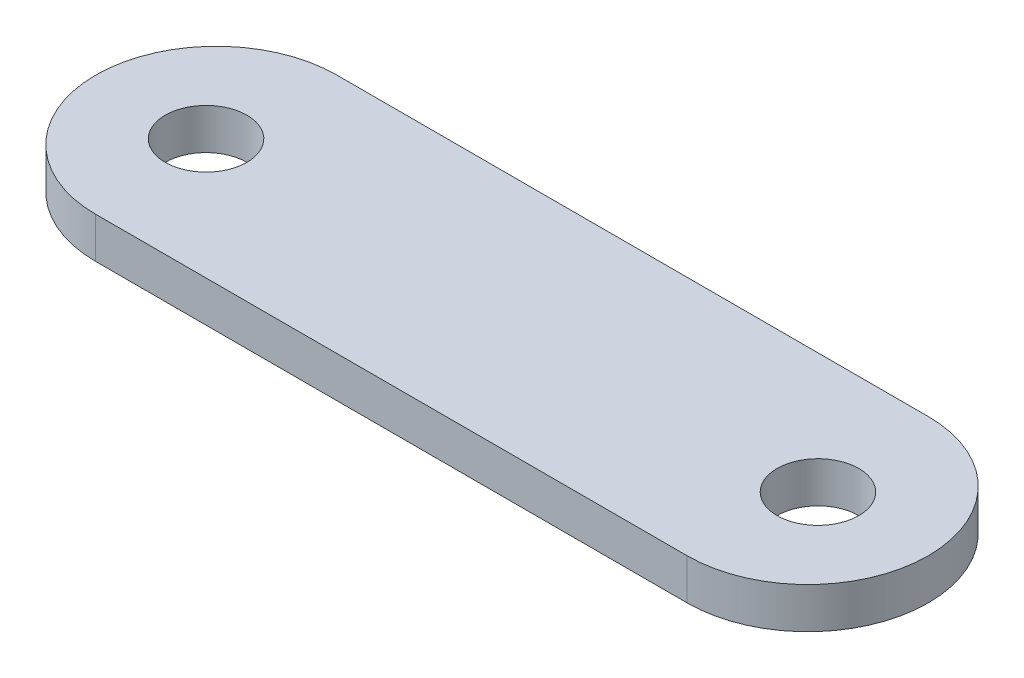
ISO-10303-21;
HEADER;
FILE_DESCRIPTION(('STEP AP214'),'2;1');
FILE_NAME('part.step','',(''),(''),'','','');
FILE_SCHEMA(('AUTOMOTIVE_DESIGN { 1 0 10303 214 1 1 1 1 }'));
ENDSEC;
DATA;
#1=APPLICATION_CONTEXT('core data for automotive mechanical design processes');
#2=APPLICATION_PROTOCOL_DEFINITION('international standard','automotive_design',2000,#1);
#3=PRODUCT_CONTEXT('',#1,'mechanical');
#4=PRODUCT('Part','Part','',(#3));
#5=PRODUCT_RELATED_PRODUCT_CATEGORY('part','',(#4));
#6=PRODUCT_DEFINITION_FORMATION('','',#4);
#7=PRODUCT_DEFINITION_CONTEXT('part definition',#1,'design');
#8=PRODUCT_DEFINITION('design','',#6,#7);
#9=PRODUCT_DEFINITION_SHAPE('','',#8);
#10=(LENGTH_UNIT() NAMED_UNIT(*) SI_UNIT(.MILLI.,.METRE.));
#11=(NAMED_UNIT(*) PLANE_ANGLE_UNIT() SI_UNIT($,.RADIAN.));
#12=(NAMED_UNIT(*) SI_UNIT($,.STERADIAN.) SOLID_ANGLE_UNIT());
#13=UNCERTAINTY_MEASURE_WITH_UNIT(LENGTH_MEASURE(1.E-05),#10,'distance_accuracy_value','');
#14=(GEOMETRIC_REPRESENTATION_CONTEXT(3) GLOBAL_UNCERTAINTY_ASSIGNED_CONTEXT((#13)) GLOBAL_UNIT_ASSIGNED_CONTEXT((#10,
#11,#12)) REPRESENTATION_CONTEXT('',''));
#15=CARTESIAN_POINT('',(0.,0.,0.));
#16=DIRECTION('',(0.,0.,1.));
#17=DIRECTION('',(1.,0.,0.));
#18=AXIS2_PLACEMENT_3D('',#15,#16,#17);
#19=CARTESIAN_POINT('',(-69.1432989690722,0.,0.));
#20=DIRECTION('',(0.,1.,0.));
#21=DIRECTION('',(0.,0.,1.));
#22=AXIS2_PLACEMENT_3D('',#19,#20,#21);
#23=PLANE('',#22);
#24=CARTESIAN_POINT('',(-69.1432989690722,0.,0.));
#25=DIRECTION('',(0.,1.,0.));
#26=DIRECTION('',(0.,0.,1.));
#27=AXIS2_PLACEMENT_3D('',#24,#25,#26);
#28=CIRCLE('',#27,5.9);
#29=CARTESIAN_POINT('',(-69.1432989690722,0.,-5.9));
#30=VERTEX_POINT('',#29);
#31=CARTESIAN_POINT('',(-69.1432989690722,0.,5.9));
#32=VERTEX_POINT('',#31);
#33=EDGE_CURVE('E134',#30,#32,#28,.T.);
#34=ORIENTED_EDGE('',*,*,#33,.F.);
#35=DIRECTION('',(-1.,0.,0.));
#36=VECTOR('',#35,1.);
#37=CARTESIAN_POINT('',(-69.1432989690722,0.,-5.9));
#38=LINE('',#37,#36);
#39=CARTESIAN_POINT('',(-40.2008621190722,0.,-5.9));
#40=VERTEX_POINT('',#39);
#41=EDGE_CURVE('E141',#40,#30,#38,.T.);
#42=ORIENTED_EDGE('',*,*,#41,.F.);
#43=CARTESIAN_POINT('',(-40.2008621190722,0.,0.));
#44=DIRECTION('',(0.,1.,0.));
#45=DIRECTION('',(0.,0.,1.));
#46=AXIS2_PLACEMENT_3D('',#43,#44,#45);
#47=CIRCLE('',#46,5.9);
#48=CARTESIAN_POINT('',(-40.2008621190722,0.,5.9));
#49=VERTEX_POINT('',#48);
#50=EDGE_CURVE('E152',#49,#40,#47,.T.);
#51=ORIENTED_EDGE('',*,*,#50,.F.);
#52=DIRECTION('',(1.,0.,0.));
#53=VECTOR('',#52,1.);
#54=CARTESIAN_POINT('',(-69.1432989690722,0.,5.9));
#55=LINE('',#54,#53);
#56=EDGE_CURVE('E150',#32,#49,#55,.T.);
#57=ORIENTED_EDGE('',*,*,#56,.F.);
#58=EDGE_LOOP('',(#34,#42,#51,#57));
#59=FACE_BOUND('',#58,.T.);
#60=CARTESIAN_POINT('',(-39.7008621190722,0.,0.));
#61=DIRECTION('',(0.,-1.,0.));
#62=DIRECTION('',(0.,0.,-1.));
#63=AXIS2_PLACEMENT_3D('',#60,#61,#62);
#64=CIRCLE('',#63,2.);
#65=CARTESIAN_POINT('',(-39.7008621190722,0.,-2.));
#66=VERTEX_POINT('',#65);
#67=EDGE_CURVE('E129',#66,#66,#64,.T.);
#68=ORIENTED_EDGE('',*,*,#67,.F.);
#69=EDGE_LOOP('',(#68));
#70=FACE_BOUND('',#69,.T.);
#71=CARTESIAN_POINT('',(-69.6432989690722,0.,0.));
#72=DIRECTION('',(0.,-1.,0.));
#73=DIRECTION('',(0.,0.,-1.));
#74=AXIS2_PLACEMENT_3D('',#71,#72,#73);
#75=CIRCLE('',#74,2.);
#76=CARTESIAN_POINT('',(-69.6432989690722,0.,-2.));
#77=VERTEX_POINT('',#76);
#78=EDGE_CURVE('E119',#77,#77,#75,.T.);
#79=ORIENTED_EDGE('',*,*,#78,.F.);
#80=EDGE_LOOP('',(#79));
#81=FACE_BOUND('',#80,.T.);
#82=DIRECTION('',(0.,0.,1.));
#83=VECTOR('',#82,1.);
#84=CARTESIAN_POINT('',(-65.1432989690722,0.,-0.999999999999999));
#85=LINE('',#84,#83);
#86=CARTESIAN_POINT('',(-65.1432989690722,0.,-0.999999999999999));
#87=VERTEX_POINT('',#86);
#88=CARTESIAN_POINT('',(-65.1432989690722,0.,1.));
#89=VERTEX_POINT('',#88);
#90=EDGE_CURVE('E118',#87,#89,#85,.T.);
#91=ORIENTED_EDGE('',*,*,#90,.F.);
#92=DIRECTION('',(1.,0.,0.));
#93=VECTOR('',#92,1.);
#94=CARTESIAN_POINT('',(-67.1432989690722,0.,-0.999999999999999));
#95=LINE('',#94,#93);
#96=CARTESIAN_POINT('',(-67.1432989690722,0.,-0.999999999999999));
#97=VERTEX_POINT('',#96);
#98=EDGE_CURVE('E115',#97,#87,#95,.T.);
#99=ORIENTED_EDGE('',*,*,#98,.F.);
#100=DIRECTION('',(0.,0.,-1.));
#101=VECTOR('',#100,1.);
#102=CARTESIAN_POINT('',(-67.1432989690722,0.,-0.999999999999999));
#103=LINE('',#102,#101);
#104=CARTESIAN_POINT('',(-67.1432989690722,0.,1.));
#105=VERTEX_POINT('',#104);
#106=EDGE_CURVE('E53',#105,#97,#103,.T.);
#107=ORIENTED_EDGE('',*,*,#106,.F.);
#108=DIRECTION('',(-1.,0.,0.));
#109=VECTOR('',#108,1.);
#110=CARTESIAN_POINT('',(-67.1432989690722,0.,1.));
#111=LINE('',#110,#109);
#112=EDGE_CURVE('E48',#89,#105,#111,.T.);
#113=ORIENTED_EDGE('',*,*,#112,.F.);
#114=EDGE_LOOP('',(#91,#99,#107,#113));
#115=FACE_BOUND('',#114,.T.);
#116=ADVANCED_FACE('F33',(#59,#70,#81,#115),#23,.F.);
#117=CARTESIAN_POINT('',(-69.1432989690722,2.,0.));
#118=DIRECTION('',(0.,-1.,0.));
#119=DIRECTION('',(0.,0.,-1.));
#120=AXIS2_PLACEMENT_3D('',#117,#118,#119);
#121=CYLINDRICAL_SURFACE('',#120,5.9);
#122=ORIENTED_EDGE('',*,*,#33,.T.);
#123=DIRECTION('',(0.,-1.,0.));
#124=VECTOR('',#123,1.);
#125=CARTESIAN_POINT('',(-69.1432989690722,2.,5.9));
#126=LINE('',#125,#124);
#127=CARTESIAN_POINT('',(-69.1432989690722,2.,5.9));
#128=VERTEX_POINT('',#127);
#129=EDGE_CURVE('E11',#128,#32,#126,.T.);
#130=ORIENTED_EDGE('',*,*,#129,.F.);
#131=CARTESIAN_POINT('',(-69.1432989690722,2.,0.));
#132=DIRECTION('',(0.,1.,0.));
#133=DIRECTION('',(0.,0.,1.));
#134=AXIS2_PLACEMENT_3D('',#131,#132,#133);
#135=CIRCLE('',#134,5.9);
#136=CARTESIAN_POINT('',(-69.1432989690722,2.,-5.9));
#137=VERTEX_POINT('',#136);
#138=EDGE_CURVE('E137',#137,#128,#135,.T.);
#139=ORIENTED_EDGE('',*,*,#138,.F.);
#140=DIRECTION('',(0.,-1.,0.));
#141=VECTOR('',#140,1.);
#142=CARTESIAN_POINT('',(-69.1432989690722,2.,-5.9));
#143=LINE('',#142,#141);
#144=EDGE_CURVE('E147',#137,#30,#143,.T.);
#145=ORIENTED_EDGE('',*,*,#144,.T.);
#146=EDGE_LOOP('',(#122,#130,#139,#145));
#147=FACE_BOUND('',#146,.T.);
#148=ADVANCED_FACE('F35',(#147),#121,.T.);
#149=CARTESIAN_POINT('',(-69.1432989690722,2.,5.9));
#150=DIRECTION('',(0.,0.,-1.));
#151=DIRECTION('',(-1.,0.,0.));
#152=AXIS2_PLACEMENT_3D('',#149,#150,#151);
#153=PLANE('',#152);
#154=ORIENTED_EDGE('',*,*,#56,.T.);
#155=DIRECTION('',(0.,-1.,0.));
#156=VECTOR('',#155,1.);
#157=CARTESIAN_POINT('',(-40.2008621190722,2.,5.9));
#158=LINE('',#157,#156);
#159=CARTESIAN_POINT('',(-40.2008621190722,2.,5.9));
#160=VERTEX_POINT('',#159);
#161=EDGE_CURVE('E41',#160,#49,#158,.T.);
#162=ORIENTED_EDGE('',*,*,#161,.F.);
#163=DIRECTION('',(1.,0.,0.));
#164=VECTOR('',#163,1.);
#165=CARTESIAN_POINT('',(-69.1432989690722,2.,5.9));
#166=LINE('',#165,#164);
#167=EDGE_CURVE('E140',#128,#160,#166,.T.);
#168=ORIENTED_EDGE('',*,*,#167,.F.);
#169=ORIENTED_EDGE('',*,*,#129,.T.);
#170=EDGE_LOOP('',(#154,#162,#168,#169));
#171=FACE_BOUND('',#170,.T.);
#172=ADVANCED_FACE('F180',(#171),#153,.F.);
#173=CARTESIAN_POINT('',(-40.2008621190722,2.,0.));
#174=DIRECTION('',(0.,-1.,0.));
#175=DIRECTION('',(0.,0.,-1.));
#176=AXIS2_PLACEMENT_3D('',#173,#174,#175);
#177=CYLINDRICAL_SURFACE('',#176,5.9);
#178=ORIENTED_EDGE('',*,*,#50,.T.);
#179=DIRECTION('',(0.,-1.,0.));
#180=VECTOR('',#179,1.);
#181=CARTESIAN_POINT('',(-40.2008621190722,2.,-5.9));
#182=LINE('',#181,#180);
#183=CARTESIAN_POINT('',(-40.2008621190722,2.,-5.9));
#184=VERTEX_POINT('',#183);
#185=EDGE_CURVE('E157',#184,#40,#182,.T.);
#186=ORIENTED_EDGE('',*,*,#185,.F.);
#187=CARTESIAN_POINT('',(-40.2008621190722,2.,0.));
#188=DIRECTION('',(0.,1.,0.));
#189=DIRECTION('',(0.,0.,1.));
#190=AXIS2_PLACEMENT_3D('',#187,#188,#189);
#191=CIRCLE('',#190,5.9);
#192=EDGE_CURVE('E143',#160,#184,#191,.T.);
#193=ORIENTED_EDGE('',*,*,#192,.F.);
#194=ORIENTED_EDGE('',*,*,#161,.T.);
#195=EDGE_LOOP('',(#178,#186,#193,#194));
#196=FACE_BOUND('',#195,.T.);
#197=ADVANCED_FACE('F164',(#196),#177,.T.);
#198=CARTESIAN_POINT('',(-69.1432989690722,2.,-5.9));
#199=DIRECTION('',(0.,0.,1.));
#200=DIRECTION('',(1.,0.,0.));
#201=AXIS2_PLACEMENT_3D('',#198,#199,#200);
#202=PLANE('',#201);
#203=ORIENTED_EDGE('',*,*,#41,.T.);
#204=ORIENTED_EDGE('',*,*,#144,.F.);
#205=DIRECTION('',(-1.,0.,0.));
#206=VECTOR('',#205,1.);
#207=CARTESIAN_POINT('',(-69.1432989690722,2.,-5.9));
#208=LINE('',#207,#206);
#209=EDGE_CURVE('E145',#184,#137,#208,.T.);
#210=ORIENTED_EDGE('',*,*,#209,.F.);
#211=ORIENTED_EDGE('',*,*,#185,.T.);
#212=EDGE_LOOP('',(#203,#204,#210,#211));
#213=FACE_BOUND('',#212,.T.);
#214=ADVANCED_FACE('F173',(#213),#202,.F.);
#215=CARTESIAN_POINT('',(-69.1432989690722,2.,0.));
#216=DIRECTION('',(0.,1.,0.));
#217=DIRECTION('',(0.,0.,1.));
#218=AXIS2_PLACEMENT_3D('',#215,#216,#217);
#219=PLANE('',#218);
#220=CARTESIAN_POINT('',(-69.6432989690722,2.,0.));
#221=DIRECTION('',(0.,-1.,0.));
#222=DIRECTION('',(0.,0.,-1.));
#223=AXIS2_PLACEMENT_3D('',#220,#221,#222);
#224=CIRCLE('',#223,2.);
#225=CARTESIAN_POINT('',(-69.6432989690722,2.,-2.));
#226=VERTEX_POINT('',#225);
#227=EDGE_CURVE('E122',#226,#226,#224,.T.);
#228=ORIENTED_EDGE('',*,*,#227,.T.);
#229=EDGE_LOOP('',(#228));
#230=FACE_BOUND('',#229,.T.);
#231=CARTESIAN_POINT('',(-39.7008621190722,2.,0.));
#232=DIRECTION('',(0.,-1.,0.));
#233=DIRECTION('',(0.,0.,-1.));
#234=AXIS2_PLACEMENT_3D('',#231,#232,#233);
#235=CIRCLE('',#234,2.);
#236=CARTESIAN_POINT('',(-39.7008621190722,2.,-2.));
#237=VERTEX_POINT('',#236);
#238=EDGE_CURVE('E131',#237,#237,#235,.T.);
#239=ORIENTED_EDGE('',*,*,#238,.T.);
#240=EDGE_LOOP('',(#239));
#241=FACE_BOUND('',#240,.T.);
#242=ORIENTED_EDGE('',*,*,#138,.T.);
#243=ORIENTED_EDGE('',*,*,#167,.T.);
#244=ORIENTED_EDGE('',*,*,#192,.T.);
#245=ORIENTED_EDGE('',*,*,#209,.T.);
#246=EDGE_LOOP('',(#242,#243,#244,#245));
#247=FACE_BOUND('',#246,.T.);
#248=ADVANCED_FACE('F179',(#230,#241,#247),#219,.T.);
#249=CARTESIAN_POINT('',(-39.7008621190722,2.,0.));
#250=DIRECTION('',(0.,-1.,0.));
#251=DIRECTION('',(0.,0.,-1.));
#252=AXIS2_PLACEMENT_3D('',#249,#250,#251);
#253=CYLINDRICAL_SURFACE('',#252,2.);
#254=ORIENTED_EDGE('',*,*,#238,.F.);
#255=EDGE_LOOP('',(#254));
#256=FACE_BOUND('',#255,.T.);
#257=ORIENTED_EDGE('',*,*,#67,.T.);
#258=EDGE_LOOP('',(#257));
#259=FACE_BOUND('',#258,.T.);
#260=ADVANCED_FACE('F200',(#256,#259),#253,.F.);
#261=CARTESIAN_POINT('',(-69.6432989690722,2.,0.));
#262=DIRECTION('',(0.,-1.,0.));
#263=DIRECTION('',(0.,0.,-1.));
#264=AXIS2_PLACEMENT_3D('',#261,#262,#263);
#265=CYLINDRICAL_SURFACE('',#264,2.);
#266=ORIENTED_EDGE('',*,*,#227,.F.);
#267=EDGE_LOOP('',(#266));
#268=FACE_BOUND('',#267,.T.);
#269=ORIENTED_EDGE('',*,*,#78,.T.);
#270=EDGE_LOOP('',(#269));
#271=FACE_BOUND('',#270,.T.);
#272=ADVANCED_FACE('F205',(#268,#271),#265,.F.);
#273=CARTESIAN_POINT('',(-65.1432989690722,-2.,-0.999999999999999));
#274=DIRECTION('',(-1.,0.,0.));
#275=DIRECTION('',(0.,0.,1.));
#276=AXIS2_PLACEMENT_3D('',#273,#274,#275);
#277=PLANE('',#276);
#278=ORIENTED_EDGE('',*,*,#90,.T.);
#279=DIRECTION('',(0.,1.,0.));
#280=VECTOR('',#279,1.);
#281=CARTESIAN_POINT('',(-65.1432989690722,-2.,1.));
#282=LINE('',#281,#280);
#283=CARTESIAN_POINT('',(-65.1432989690722,-2.,1.));
#284=VERTEX_POINT('',#283);
#285=EDGE_CURVE('E99',#284,#89,#282,.T.);
#286=ORIENTED_EDGE('',*,*,#285,.F.);
#287=DIRECTION('',(0.,0.,1.));
#288=VECTOR('',#287,1.);
#289=CARTESIAN_POINT('',(-65.1432989690722,-2.,-0.999999999999999));
#290=LINE('',#289,#288);
#291=CARTESIAN_POINT('',(-65.1432989690722,-2.,-0.999999999999999));
#292=VERTEX_POINT('',#291);
#293=EDGE_CURVE('E106',#292,#284,#290,.T.);
#294=ORIENTED_EDGE('',*,*,#293,.F.);
#295=DIRECTION('',(0.,1.,0.));
#296=VECTOR('',#295,1.);
#297=CARTESIAN_POINT('',(-65.1432989690722,-2.,-0.999999999999999));
#298=LINE('',#297,#296);
#299=EDGE_CURVE('E219',#292,#87,#298,.T.);
#300=ORIENTED_EDGE('',*,*,#299,.T.);
#301=EDGE_LOOP('',(#278,#286,#294,#300));
#302=FACE_BOUND('',#301,.T.);
#303=ADVANCED_FACE('F117',(#302),#277,.F.);
#304=CARTESIAN_POINT('',(-67.1432989690722,-2.,1.));
#305=DIRECTION('',(0.,0.,-1.));
#306=DIRECTION('',(-1.,0.,0.));
#307=AXIS2_PLACEMENT_3D('',#304,#305,#306);
#308=PLANE('',#307);
#309=ORIENTED_EDGE('',*,*,#112,.T.);
#310=DIRECTION('',(0.,1.,0.));
#311=VECTOR('',#310,1.);
#312=CARTESIAN_POINT('',(-67.1432989690722,-2.,1.));
#313=LINE('',#312,#311);
#314=CARTESIAN_POINT('',(-67.1432989690722,-2.,1.));
#315=VERTEX_POINT('',#314);
#316=EDGE_CURVE('E102',#315,#105,#313,.T.);
#317=ORIENTED_EDGE('',*,*,#316,.F.);
#318=DIRECTION('',(-1.,0.,0.));
#319=VECTOR('',#318,1.);
#320=CARTESIAN_POINT('',(-67.1432989690722,-2.,1.));
#321=LINE('',#320,#319);
#322=EDGE_CURVE('E95',#284,#315,#321,.T.);
#323=ORIENTED_EDGE('',*,*,#322,.F.);
#324=ORIENTED_EDGE('',*,*,#285,.T.);
#325=EDGE_LOOP('',(#309,#317,#323,#324));
#326=FACE_BOUND('',#325,.T.);
#327=ADVANCED_FACE('F97',(#326),#308,.F.);
#328=CARTESIAN_POINT('',(-67.1432989690722,-2.,-0.999999999999999));
#329=DIRECTION('',(1.,0.,0.));
#330=DIRECTION('',(0.,0.,-1.));
#331=AXIS2_PLACEMENT_3D('',#328,#329,#330);
#332=PLANE('',#331);
#333=ORIENTED_EDGE('',*,*,#106,.T.);
#334=DIRECTION('',(0.,1.,0.));
#335=VECTOR('',#334,1.);
#336=CARTESIAN_POINT('',(-67.1432989690722,-2.,-0.999999999999999));
#337=LINE('',#336,#335);
#338=CARTESIAN_POINT('',(-67.1432989690722,-2.,-0.999999999999999));
#339=VERTEX_POINT('',#338);
#340=EDGE_CURVE('E124',#339,#97,#337,.T.);
#341=ORIENTED_EDGE('',*,*,#340,.F.);
#342=DIRECTION('',(0.,0.,-1.));
#343=VECTOR('',#342,1.);
#344=CARTESIAN_POINT('',(-67.1432989690722,-2.,-0.999999999999999));
#345=LINE('',#344,#343);
#346=EDGE_CURVE('E105',#315,#339,#345,.T.);
#347=ORIENTED_EDGE('',*,*,#346,.F.);
#348=ORIENTED_EDGE('',*,*,#316,.T.);
#349=EDGE_LOOP('',(#333,#341,#347,#348));
#350=FACE_BOUND('',#349,.T.);
#351=ADVANCED_FACE('F228',(#350),#332,.F.);
#352=CARTESIAN_POINT('',(-67.1432989690722,-2.,-0.999999999999999));
#353=DIRECTION('',(0.,0.,1.));
#354=DIRECTION('',(1.,0.,0.));
#355=AXIS2_PLACEMENT_3D('',#352,#353,#354);
#356=PLANE('',#355);
#357=ORIENTED_EDGE('',*,*,#98,.T.);
#358=ORIENTED_EDGE('',*,*,#299,.F.);
#359=DIRECTION('',(1.,0.,0.));
#360=VECTOR('',#359,1.);
#361=CARTESIAN_POINT('',(-67.1432989690722,-2.,-0.999999999999999));
#362=LINE('',#361,#360);
#363=EDGE_CURVE('E111',#339,#292,#362,.T.);
#364=ORIENTED_EDGE('',*,*,#363,.F.);
#365=ORIENTED_EDGE('',*,*,#340,.T.);
#366=EDGE_LOOP('',(#357,#358,#364,#365));
#367=FACE_BOUND('',#366,.T.);
#368=ADVANCED_FACE('F218',(#367),#356,.F.);
#369=CARTESIAN_POINT('',(0.,-2.,0.));
#370=DIRECTION('',(0.,1.,0.));
#371=DIRECTION('',(0.,0.,1.));
#372=AXIS2_PLACEMENT_3D('',#369,#370,#371);
#373=PLANE('',#372);
#374=ORIENTED_EDGE('',*,*,#293,.T.);
#375=ORIENTED_EDGE('',*,*,#322,.T.);
#376=ORIENTED_EDGE('',*,*,#346,.T.);
#377=ORIENTED_EDGE('',*,*,#363,.T.);
#378=EDGE_LOOP('',(#374,#375,#376,#377));
#379=FACE_BOUND('',#378,.T.);
#380=ADVANCED_FACE('F109',(#379),#373,.F.);
#381=CLOSED_SHELL('',(#116,#148,#172,#197,#214,#248,#260,#272,#303,#327,#351,#368,#380));
#382=MANIFOLD_SOLID_BREP('B2',#381);
#383=ADVANCED_BREP_SHAPE_REPRESENTATION('',(#18,#382),#14);
#384=SHAPE_DEFINITION_REPRESENTATION(#9,#383);
ENDSEC;
END-ISO-10303-21;
